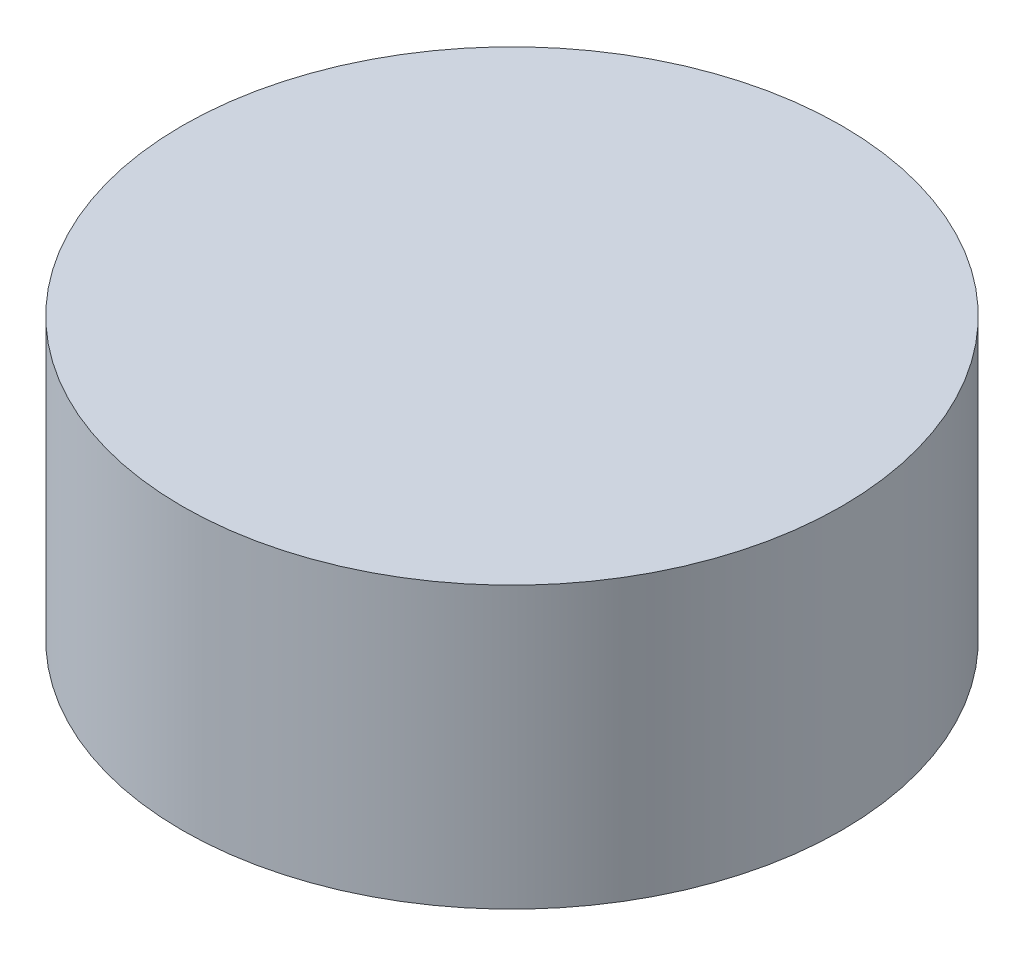
ISO-10303-21;
HEADER;
FILE_DESCRIPTION(('STEP AP214'),'2;1');
FILE_NAME('part.step','',(''),(''),'','','');
FILE_SCHEMA(('AUTOMOTIVE_DESIGN { 1 0 10303 214 1 1 1 1 }'));
ENDSEC;
DATA;
#1=APPLICATION_CONTEXT('core data for automotive mechanical design processes');
#2=APPLICATION_PROTOCOL_DEFINITION('international standard','automotive_design',2000,#1);
#3=PRODUCT_CONTEXT('',#1,'mechanical');
#4=PRODUCT('Part','Part','',(#3));
#5=PRODUCT_RELATED_PRODUCT_CATEGORY('part','',(#4));
#6=PRODUCT_DEFINITION_FORMATION('','',#4);
#7=PRODUCT_DEFINITION_CONTEXT('part definition',#1,'design');
#8=PRODUCT_DEFINITION('design','',#6,#7);
#9=PRODUCT_DEFINITION_SHAPE('','',#8);
#10=(LENGTH_UNIT() NAMED_UNIT(*) SI_UNIT(.MILLI.,.METRE.));
#11=(NAMED_UNIT(*) PLANE_ANGLE_UNIT() SI_UNIT($,.RADIAN.));
#12=(NAMED_UNIT(*) SI_UNIT($,.STERADIAN.) SOLID_ANGLE_UNIT());
#13=UNCERTAINTY_MEASURE_WITH_UNIT(LENGTH_MEASURE(1.E-05),#10,'distance_accuracy_value','');
#14=(GEOMETRIC_REPRESENTATION_CONTEXT(3) GLOBAL_UNCERTAINTY_ASSIGNED_CONTEXT((#13)) GLOBAL_UNIT_ASSIGNED_CONTEXT((#10,
#11,#12)) REPRESENTATION_CONTEXT('',''));
#15=CARTESIAN_POINT('',(0.,0.,0.));
#16=DIRECTION('',(0.,0.,1.));
#17=DIRECTION('',(1.,0.,0.));
#18=AXIS2_PLACEMENT_3D('',#15,#16,#17);
#19=CARTESIAN_POINT('',(0.,1.,0.));
#20=DIRECTION('',(0.,-1.,0.));
#21=DIRECTION('',(0.,0.,-1.));
#22=AXIS2_PLACEMENT_3D('',#19,#20,#21);
#23=CYLINDRICAL_SURFACE('',#22,1.175);
#24=CARTESIAN_POINT('',(0.,1.,0.));
#25=DIRECTION('',(0.,1.,0.));
#26=DIRECTION('',(0.,0.,1.));
#27=AXIS2_PLACEMENT_3D('',#24,#25,#26);
#28=CIRCLE('',#27,1.175);
#29=CARTESIAN_POINT('',(0.,1.,1.175));
#30=VERTEX_POINT('',#29);
#31=EDGE_CURVE('E10',#30,#30,#28,.T.);
#32=ORIENTED_EDGE('',*,*,#31,.F.);
#33=EDGE_LOOP('',(#32));
#34=FACE_BOUND('',#33,.T.);
#35=CARTESIAN_POINT('',(0.,0.,0.));
#36=DIRECTION('',(0.,1.,0.));
#37=DIRECTION('',(0.,0.,1.));
#38=AXIS2_PLACEMENT_3D('',#35,#36,#37);
#39=CIRCLE('',#38,1.175);
#40=CARTESIAN_POINT('',(0.,0.,1.175));
#41=VERTEX_POINT('',#40);
#42=EDGE_CURVE('E34',#41,#41,#39,.T.);
#43=ORIENTED_EDGE('',*,*,#42,.T.);
#44=EDGE_LOOP('',(#43));
#45=FACE_BOUND('',#44,.T.);
#46=ADVANCED_FACE('F31',(#34,#45),#23,.T.);
#47=CARTESIAN_POINT('',(0.,1.,0.));
#48=DIRECTION('',(0.,1.,0.));
#49=DIRECTION('',(0.,0.,1.));
#50=AXIS2_PLACEMENT_3D('',#47,#48,#49);
#51=PLANE('',#50);
#52=ORIENTED_EDGE('',*,*,#31,.T.);
#53=EDGE_LOOP('',(#52));
#54=FACE_BOUND('',#53,.T.);
#55=ADVANCED_FACE('F46',(#54),#51,.T.);
#56=CARTESIAN_POINT('',(0.,0.,0.));
#57=DIRECTION('',(0.,1.,0.));
#58=DIRECTION('',(0.,0.,1.));
#59=AXIS2_PLACEMENT_3D('',#56,#57,#58);
#60=PLANE('',#59);
#61=ORIENTED_EDGE('',*,*,#42,.F.);
#62=EDGE_LOOP('',(#61));
#63=FACE_BOUND('',#62,.T.);
#64=ADVANCED_FACE('F44',(#63),#60,.F.);
#65=CLOSED_SHELL('',(#46,#55,#64));
#66=MANIFOLD_SOLID_BREP('B2',#65);
#67=ADVANCED_BREP_SHAPE_REPRESENTATION('',(#18,#66),#14);
#68=SHAPE_DEFINITION_REPRESENTATION(#9,#67);
ENDSEC;
END-ISO-10303-21;
